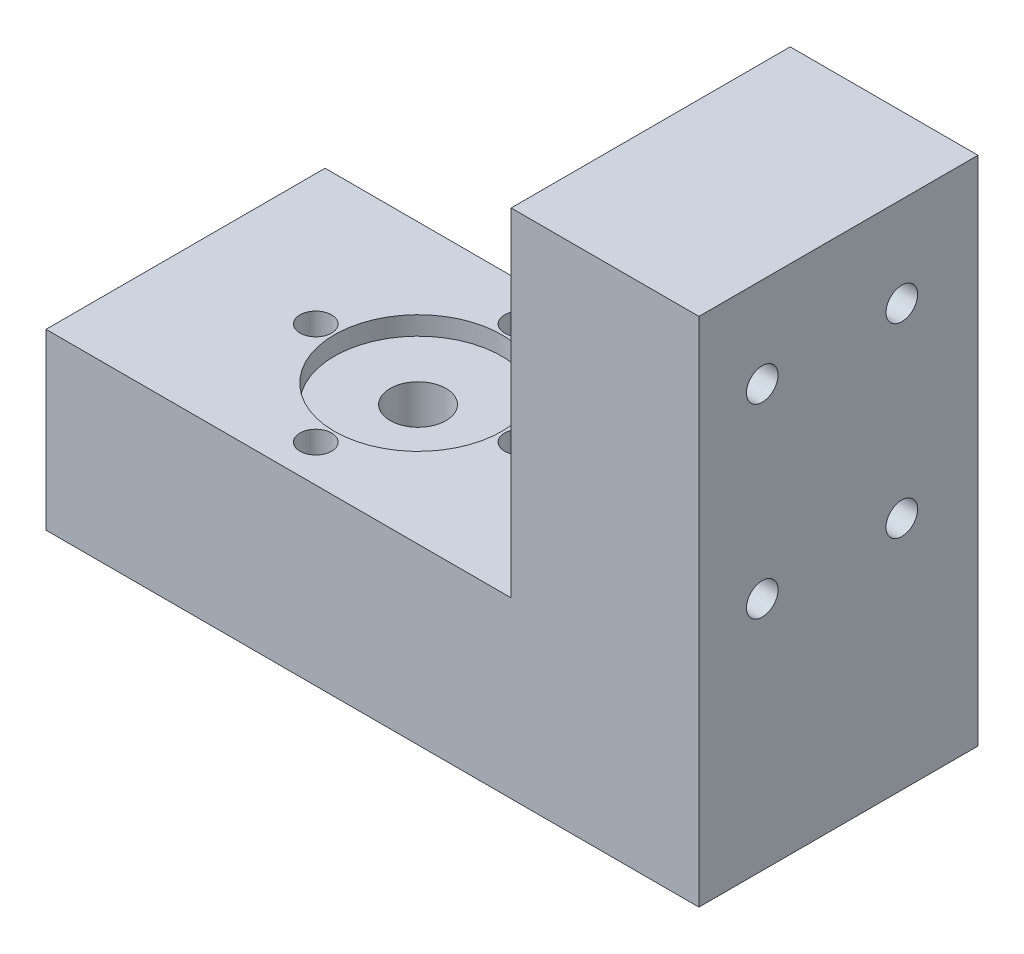
ISO-10303-21;
HEADER;
FILE_DESCRIPTION(('STEP AP214'),'2;1');
FILE_NAME('part.step','',(''),(''),'','','');
FILE_SCHEMA(('AUTOMOTIVE_DESIGN { 1 0 10303 214 1 1 1 1 }'));
ENDSEC;
DATA;
#1=APPLICATION_CONTEXT('core data for automotive mechanical design processes');
#2=APPLICATION_PROTOCOL_DEFINITION('international standard','automotive_design',2000,#1);
#3=PRODUCT_CONTEXT('',#1,'mechanical');
#4=PRODUCT('Part','Part','',(#3));
#5=PRODUCT_RELATED_PRODUCT_CATEGORY('part','',(#4));
#6=PRODUCT_DEFINITION_FORMATION('','',#4);
#7=PRODUCT_DEFINITION_CONTEXT('part definition',#1,'design');
#8=PRODUCT_DEFINITION('design','',#6,#7);
#9=PRODUCT_DEFINITION_SHAPE('','',#8);
#10=(LENGTH_UNIT() NAMED_UNIT(*) SI_UNIT(.MILLI.,.METRE.));
#11=(NAMED_UNIT(*) PLANE_ANGLE_UNIT() SI_UNIT($,.RADIAN.));
#12=(NAMED_UNIT(*) SI_UNIT($,.STERADIAN.) SOLID_ANGLE_UNIT());
#13=UNCERTAINTY_MEASURE_WITH_UNIT(LENGTH_MEASURE(1.E-05),#10,'distance_accuracy_value','');
#14=(GEOMETRIC_REPRESENTATION_CONTEXT(3) GLOBAL_UNCERTAINTY_ASSIGNED_CONTEXT((#13)) GLOBAL_UNIT_ASSIGNED_CONTEXT((#10,
#11,#12)) REPRESENTATION_CONTEXT('',''));
#15=CARTESIAN_POINT('',(0.,0.,0.));
#16=DIRECTION('',(0.,0.,1.));
#17=DIRECTION('',(1.,0.,0.));
#18=AXIS2_PLACEMENT_3D('',#15,#16,#17);
#19=CARTESIAN_POINT('',(70.19,0.,-30.));
#20=DIRECTION('',(0.,-1.,0.));
#21=DIRECTION('',(1.,0.,0.));
#22=AXIS2_PLACEMENT_3D('',#19,#20,#21);
#23=PLANE('',#22);
#24=CARTESIAN_POINT('',(25.,0.,-26.));
#25=DIRECTION('',(0.,1.,0.));
#26=DIRECTION('',(0.,0.,1.));
#27=AXIS2_PLACEMENT_3D('',#24,#25,#26);
#28=CIRCLE('',#27,1.7);
#29=CARTESIAN_POINT('',(25.,0.,-24.3));
#30=VERTEX_POINT('',#29);
#31=EDGE_CURVE('E210',#30,#30,#28,.T.);
#32=ORIENTED_EDGE('',*,*,#31,.T.);
#33=EDGE_LOOP('',(#32));
#34=FACE_BOUND('',#33,.T.);
#35=CARTESIAN_POINT('',(14.0000000000003,0.,-14.9999999999998));
#36=DIRECTION('',(0.,1.,0.));
#37=DIRECTION('',(0.,0.,1.));
#38=AXIS2_PLACEMENT_3D('',#35,#36,#37);
#39=CIRCLE('',#38,1.7);
#40=CARTESIAN_POINT('',(14.0000000000003,0.,-13.2999999999998));
#41=VERTEX_POINT('',#40);
#42=EDGE_CURVE('E209',#41,#41,#39,.T.);
#43=ORIENTED_EDGE('',*,*,#42,.T.);
#44=EDGE_LOOP('',(#43));
#45=FACE_BOUND('',#44,.T.);
#46=CARTESIAN_POINT('',(25.0000000000005,0.,-3.99999999999999));
#47=DIRECTION('',(0.,1.,0.));
#48=DIRECTION('',(0.,0.,1.));
#49=AXIS2_PLACEMENT_3D('',#46,#47,#48);
#50=CIRCLE('',#49,1.7);
#51=CARTESIAN_POINT('',(25.0000000000005,0.,-2.29999999999999));
#52=VERTEX_POINT('',#51);
#53=EDGE_CURVE('E221',#52,#52,#50,.T.);
#54=ORIENTED_EDGE('',*,*,#53,.T.);
#55=EDGE_LOOP('',(#54));
#56=FACE_BOUND('',#55,.T.);
#57=CARTESIAN_POINT('',(36.0000000000003,0.,-15.0000000000002));
#58=DIRECTION('',(0.,1.,0.));
#59=DIRECTION('',(0.,0.,1.));
#60=AXIS2_PLACEMENT_3D('',#57,#58,#59);
#61=CIRCLE('',#60,1.7);
#62=CARTESIAN_POINT('',(36.0000000000003,0.,-13.3000000000002));
#63=VERTEX_POINT('',#62);
#64=EDGE_CURVE('E220',#63,#63,#61,.T.);
#65=ORIENTED_EDGE('',*,*,#64,.T.);
#66=EDGE_LOOP('',(#65));
#67=FACE_BOUND('',#66,.T.);
#68=CARTESIAN_POINT('',(25.,0.,-15.));
#69=DIRECTION('',(0.,1.,0.));
#70=DIRECTION('',(0.,0.,1.));
#71=AXIS2_PLACEMENT_3D('',#68,#69,#70);
#72=CIRCLE('',#71,3.);
#73=CARTESIAN_POINT('',(25.,0.,-12.));
#74=VERTEX_POINT('',#73);
#75=EDGE_CURVE('E216',#74,#74,#72,.T.);
#76=ORIENTED_EDGE('',*,*,#75,.T.);
#77=EDGE_LOOP('',(#76));
#78=FACE_BOUND('',#77,.T.);
#79=DIRECTION('',(1.,0.,0.));
#80=VECTOR('',#79,1.);
#81=CARTESIAN_POINT('',(70.19,0.,0.));
#82=LINE('',#81,#80);
#83=CARTESIAN_POINT('',(0.,0.,0.));
#84=VERTEX_POINT('',#83);
#85=CARTESIAN_POINT('',(70.19,0.,0.));
#86=VERTEX_POINT('',#85);
#87=EDGE_CURVE('E128',#84,#86,#82,.T.);
#88=ORIENTED_EDGE('',*,*,#87,.F.);
#89=DIRECTION('',(0.,0.,1.));
#90=VECTOR('',#89,1.);
#91=CARTESIAN_POINT('',(0.,0.,-30.));
#92=LINE('',#91,#90);
#93=CARTESIAN_POINT('',(0.,0.,-30.));
#94=VERTEX_POINT('',#93);
#95=EDGE_CURVE('E11',#94,#84,#92,.T.);
#96=ORIENTED_EDGE('',*,*,#95,.F.);
#97=DIRECTION('',(1.,0.,0.));
#98=VECTOR('',#97,1.);
#99=CARTESIAN_POINT('',(70.19,0.,-30.));
#100=LINE('',#99,#98);
#101=CARTESIAN_POINT('',(70.19,0.,-30.));
#102=VERTEX_POINT('',#101);
#103=EDGE_CURVE('E143',#94,#102,#100,.T.);
#104=ORIENTED_EDGE('',*,*,#103,.T.);
#105=DIRECTION('',(0.,0.,1.));
#106=VECTOR('',#105,1.);
#107=CARTESIAN_POINT('',(70.19,0.,-30.));
#108=LINE('',#107,#106);
#109=EDGE_CURVE('E92',#102,#86,#108,.T.);
#110=ORIENTED_EDGE('',*,*,#109,.T.);
#111=EDGE_LOOP('',(#88,#96,#104,#110));
#112=FACE_BOUND('',#111,.T.);
#113=ADVANCED_FACE('F42',(#34,#45,#56,#67,#78,#112),#23,.T.);
#114=CARTESIAN_POINT('',(0.,0.,-30.));
#115=DIRECTION('',(-1.,0.,0.));
#116=DIRECTION('',(0.,0.,1.));
#117=AXIS2_PLACEMENT_3D('',#114,#115,#116);
#118=PLANE('',#117);
#119=DIRECTION('',(0.,-1.,0.));
#120=VECTOR('',#119,1.);
#121=CARTESIAN_POINT('',(0.,0.,0.));
#122=LINE('',#121,#120);
#123=CARTESIAN_POINT('',(0.,18.7,0.));
#124=VERTEX_POINT('',#123);
#125=EDGE_CURVE('E141',#124,#84,#122,.T.);
#126=ORIENTED_EDGE('',*,*,#125,.F.);
#127=DIRECTION('',(0.,0.,1.));
#128=VECTOR('',#127,1.);
#129=CARTESIAN_POINT('',(0.,18.7,-30.));
#130=LINE('',#129,#128);
#131=CARTESIAN_POINT('',(0.,18.7,-30.));
#132=VERTEX_POINT('',#131);
#133=EDGE_CURVE('E51',#132,#124,#130,.T.);
#134=ORIENTED_EDGE('',*,*,#133,.F.);
#135=DIRECTION('',(0.,-1.,0.));
#136=VECTOR('',#135,1.);
#137=CARTESIAN_POINT('',(0.,0.,-30.));
#138=LINE('',#137,#136);
#139=EDGE_CURVE('E118',#132,#94,#138,.T.);
#140=ORIENTED_EDGE('',*,*,#139,.T.);
#141=ORIENTED_EDGE('',*,*,#95,.T.);
#142=EDGE_LOOP('',(#126,#134,#140,#141));
#143=FACE_BOUND('',#142,.T.);
#144=ADVANCED_FACE('F152',(#143),#118,.T.);
#145=CARTESIAN_POINT('',(0.,18.7,-30.));
#146=DIRECTION('',(0.,1.,0.));
#147=DIRECTION('',(0.,0.,1.));
#148=AXIS2_PLACEMENT_3D('',#145,#146,#147);
#149=PLANE('',#148);
#150=CARTESIAN_POINT('',(25.,18.7,-26.));
#151=DIRECTION('',(0.,1.,0.));
#152=DIRECTION('',(0.,0.,1.));
#153=AXIS2_PLACEMENT_3D('',#150,#151,#152);
#154=CIRCLE('',#153,1.7);
#155=CARTESIAN_POINT('',(25.,18.7,-24.3));
#156=VERTEX_POINT('',#155);
#157=EDGE_CURVE('E213',#156,#156,#154,.T.);
#158=ORIENTED_EDGE('',*,*,#157,.F.);
#159=EDGE_LOOP('',(#158));
#160=FACE_BOUND('',#159,.T.);
#161=CARTESIAN_POINT('',(14.0000000000003,18.7,-14.9999999999998));
#162=DIRECTION('',(0.,1.,0.));
#163=DIRECTION('',(0.,0.,1.));
#164=AXIS2_PLACEMENT_3D('',#161,#162,#163);
#165=CIRCLE('',#164,1.7);
#166=CARTESIAN_POINT('',(14.0000000000003,18.7,-13.2999999999998));
#167=VERTEX_POINT('',#166);
#168=EDGE_CURVE('E224',#167,#167,#165,.T.);
#169=ORIENTED_EDGE('',*,*,#168,.F.);
#170=EDGE_LOOP('',(#169));
#171=FACE_BOUND('',#170,.T.);
#172=CARTESIAN_POINT('',(25.0000000000005,18.7,-3.99999999999999));
#173=DIRECTION('',(0.,1.,0.));
#174=DIRECTION('',(0.,0.,1.));
#175=AXIS2_PLACEMENT_3D('',#172,#173,#174);
#176=CIRCLE('',#175,1.7);
#177=CARTESIAN_POINT('',(25.0000000000005,18.7,-2.29999999999999));
#178=VERTEX_POINT('',#177);
#179=EDGE_CURVE('E217',#178,#178,#176,.T.);
#180=ORIENTED_EDGE('',*,*,#179,.F.);
#181=EDGE_LOOP('',(#180));
#182=FACE_BOUND('',#181,.T.);
#183=CARTESIAN_POINT('',(36.0000000000003,18.7,-15.0000000000002));
#184=DIRECTION('',(0.,1.,0.));
#185=DIRECTION('',(0.,0.,1.));
#186=AXIS2_PLACEMENT_3D('',#183,#184,#185);
#187=CIRCLE('',#186,1.7);
#188=CARTESIAN_POINT('',(36.0000000000003,18.7,-13.3000000000002));
#189=VERTEX_POINT('',#188);
#190=EDGE_CURVE('E231',#189,#189,#187,.T.);
#191=ORIENTED_EDGE('',*,*,#190,.F.);
#192=EDGE_LOOP('',(#191));
#193=FACE_BOUND('',#192,.T.);
#194=CARTESIAN_POINT('',(25.,18.7,-15.));
#195=DIRECTION('',(0.,1.,0.));
#196=DIRECTION('',(0.,0.,1.));
#197=AXIS2_PLACEMENT_3D('',#194,#195,#196);
#198=CIRCLE('',#197,9.);
#199=CARTESIAN_POINT('',(25.,18.7,-6.));
#200=VERTEX_POINT('',#199);
#201=EDGE_CURVE('E238',#200,#200,#198,.T.);
#202=ORIENTED_EDGE('',*,*,#201,.F.);
#203=EDGE_LOOP('',(#202));
#204=FACE_BOUND('',#203,.T.);
#205=DIRECTION('',(-1.,0.,0.));
#206=VECTOR('',#205,1.);
#207=CARTESIAN_POINT('',(0.,18.7,0.));
#208=LINE('',#207,#206);
#209=CARTESIAN_POINT('',(50.,18.7,0.));
#210=VERTEX_POINT('',#209);
#211=EDGE_CURVE('E105',#210,#124,#208,.T.);
#212=ORIENTED_EDGE('',*,*,#211,.F.);
#213=DIRECTION('',(0.,0.,1.));
#214=VECTOR('',#213,1.);
#215=CARTESIAN_POINT('',(50.,18.7,-30.));
#216=LINE('',#215,#214);
#217=CARTESIAN_POINT('',(50.,18.7,-30.));
#218=VERTEX_POINT('',#217);
#219=EDGE_CURVE('E100',#218,#210,#216,.T.);
#220=ORIENTED_EDGE('',*,*,#219,.F.);
#221=DIRECTION('',(-1.,0.,0.));
#222=VECTOR('',#221,1.);
#223=CARTESIAN_POINT('',(0.,18.7,-30.));
#224=LINE('',#223,#222);
#225=EDGE_CURVE('E103',#218,#132,#224,.T.);
#226=ORIENTED_EDGE('',*,*,#225,.T.);
#227=ORIENTED_EDGE('',*,*,#133,.T.);
#228=EDGE_LOOP('',(#212,#220,#226,#227));
#229=FACE_BOUND('',#228,.T.);
#230=ADVANCED_FACE('F102',(#160,#171,#182,#193,#204,#229),#149,.T.);
#231=CARTESIAN_POINT('',(50.,18.7,-30.));
#232=DIRECTION('',(-1.,0.,0.));
#233=DIRECTION('',(0.,0.,1.));
#234=AXIS2_PLACEMENT_3D('',#231,#232,#233);
#235=PLANE('',#234);
#236=CARTESIAN_POINT('',(50.,25.3039717979105,-6.81050399488545));
#237=DIRECTION('',(-1.,0.,0.));
#238=DIRECTION('',(0.,0.,1.));
#239=AXIS2_PLACEMENT_3D('',#236,#237,#238);
#240=CIRCLE('',#239,1.7);
#241=CARTESIAN_POINT('',(50.,25.3039717979105,-5.11050399488546));
#242=VERTEX_POINT('',#241);
#243=EDGE_CURVE('E206',#242,#242,#240,.T.);
#244=ORIENTED_EDGE('',*,*,#243,.F.);
#245=EDGE_LOOP('',(#244));
#246=FACE_BOUND('',#245,.T.);
#247=CARTESIAN_POINT('',(50.,45.3039717979105,-21.8105039948855));
#248=DIRECTION('',(-1.,0.,0.));
#249=DIRECTION('',(0.,0.,1.));
#250=AXIS2_PLACEMENT_3D('',#247,#248,#249);
#251=CIRCLE('',#250,1.7);
#252=CARTESIAN_POINT('',(50.,45.3039717979105,-20.1105039948855));
#253=VERTEX_POINT('',#252);
#254=EDGE_CURVE('E203',#253,#253,#251,.T.);
#255=ORIENTED_EDGE('',*,*,#254,.F.);
#256=EDGE_LOOP('',(#255));
#257=FACE_BOUND('',#256,.T.);
#258=CARTESIAN_POINT('',(50.,25.3039717979105,-21.8105039948855));
#259=DIRECTION('',(-1.,0.,0.));
#260=DIRECTION('',(0.,0.,1.));
#261=AXIS2_PLACEMENT_3D('',#258,#259,#260);
#262=CIRCLE('',#261,1.7);
#263=CARTESIAN_POINT('',(50.,25.3039717979105,-20.1105039948855));
#264=VERTEX_POINT('',#263);
#265=EDGE_CURVE('E196',#264,#264,#262,.T.);
#266=ORIENTED_EDGE('',*,*,#265,.F.);
#267=EDGE_LOOP('',(#266));
#268=FACE_BOUND('',#267,.T.);
#269=CARTESIAN_POINT('',(50.,45.3039717979105,-6.81050399488545));
#270=DIRECTION('',(-1.,0.,0.));
#271=DIRECTION('',(0.,0.,1.));
#272=AXIS2_PLACEMENT_3D('',#269,#270,#271);
#273=CIRCLE('',#272,1.7);
#274=CARTESIAN_POINT('',(50.,45.3039717979105,-5.11050399488546));
#275=VERTEX_POINT('',#274);
#276=EDGE_CURVE('E193',#275,#275,#273,.T.);
#277=ORIENTED_EDGE('',*,*,#276,.F.);
#278=EDGE_LOOP('',(#277));
#279=FACE_BOUND('',#278,.T.);
#280=DIRECTION('',(0.,-1.,0.));
#281=VECTOR('',#280,1.);
#282=CARTESIAN_POINT('',(50.,18.7,0.));
#283=LINE('',#282,#281);
#284=CARTESIAN_POINT('',(50.,55.,0.));
#285=VERTEX_POINT('',#284);
#286=EDGE_CURVE('E138',#285,#210,#283,.T.);
#287=ORIENTED_EDGE('',*,*,#286,.F.);
#288=DIRECTION('',(0.,0.,1.));
#289=VECTOR('',#288,1.);
#290=CARTESIAN_POINT('',(50.,55.,-30.));
#291=LINE('',#290,#289);
#292=CARTESIAN_POINT('',(50.,55.,-30.));
#293=VERTEX_POINT('',#292);
#294=EDGE_CURVE('E110',#293,#285,#291,.T.);
#295=ORIENTED_EDGE('',*,*,#294,.F.);
#296=DIRECTION('',(0.,-1.,0.));
#297=VECTOR('',#296,1.);
#298=CARTESIAN_POINT('',(50.,18.7,-30.));
#299=LINE('',#298,#297);
#300=EDGE_CURVE('E116',#293,#218,#299,.T.);
#301=ORIENTED_EDGE('',*,*,#300,.T.);
#302=ORIENTED_EDGE('',*,*,#219,.T.);
#303=EDGE_LOOP('',(#287,#295,#301,#302));
#304=FACE_BOUND('',#303,.T.);
#305=ADVANCED_FACE('F120',(#246,#257,#268,#279,#304),#235,.T.);
#306=CARTESIAN_POINT('',(50.,55.,-30.));
#307=DIRECTION('',(0.,1.,0.));
#308=DIRECTION('',(0.,0.,1.));
#309=AXIS2_PLACEMENT_3D('',#306,#307,#308);
#310=PLANE('',#309);
#311=DIRECTION('',(-1.,0.,0.));
#312=VECTOR('',#311,1.);
#313=CARTESIAN_POINT('',(50.,55.,0.));
#314=LINE('',#313,#312);
#315=CARTESIAN_POINT('',(70.19,55.,0.));
#316=VERTEX_POINT('',#315);
#317=EDGE_CURVE('E135',#316,#285,#314,.T.);
#318=ORIENTED_EDGE('',*,*,#317,.F.);
#319=DIRECTION('',(0.,0.,1.));
#320=VECTOR('',#319,1.);
#321=CARTESIAN_POINT('',(70.19,55.,-30.));
#322=LINE('',#321,#320);
#323=CARTESIAN_POINT('',(70.19,55.,-30.));
#324=VERTEX_POINT('',#323);
#325=EDGE_CURVE('E147',#324,#316,#322,.T.);
#326=ORIENTED_EDGE('',*,*,#325,.F.);
#327=DIRECTION('',(-1.,0.,0.));
#328=VECTOR('',#327,1.);
#329=CARTESIAN_POINT('',(50.,55.,-30.));
#330=LINE('',#329,#328);
#331=EDGE_CURVE('E121',#324,#293,#330,.T.);
#332=ORIENTED_EDGE('',*,*,#331,.T.);
#333=ORIENTED_EDGE('',*,*,#294,.T.);
#334=EDGE_LOOP('',(#318,#326,#332,#333));
#335=FACE_BOUND('',#334,.T.);
#336=ADVANCED_FACE('F168',(#335),#310,.T.);
#337=CARTESIAN_POINT('',(70.19,55.,-30.));
#338=DIRECTION('',(1.,0.,0.));
#339=DIRECTION('',(0.,1.,0.));
#340=AXIS2_PLACEMENT_3D('',#337,#338,#339);
#341=PLANE('',#340);
#342=CARTESIAN_POINT('',(70.19,25.3039717979105,-6.81050399488545));
#343=DIRECTION('',(1.,0.,0.));
#344=DIRECTION('',(0.,1.,0.));
#345=AXIS2_PLACEMENT_3D('',#342,#343,#344);
#346=CIRCLE('',#345,1.7);
#347=CARTESIAN_POINT('',(70.19,27.0039717979105,-6.81050399488545));
#348=VERTEX_POINT('',#347);
#349=EDGE_CURVE('E180',#348,#348,#346,.T.);
#350=ORIENTED_EDGE('',*,*,#349,.F.);
#351=EDGE_LOOP('',(#350));
#352=FACE_BOUND('',#351,.T.);
#353=CARTESIAN_POINT('',(70.19,45.3039717979105,-21.8105039948855));
#354=DIRECTION('',(1.,0.,0.));
#355=DIRECTION('',(0.,1.,0.));
#356=AXIS2_PLACEMENT_3D('',#353,#354,#355);
#357=CIRCLE('',#356,1.7);
#358=CARTESIAN_POINT('',(70.19,47.0039717979105,-21.8105039948855));
#359=VERTEX_POINT('',#358);
#360=EDGE_CURVE('E184',#359,#359,#357,.T.);
#361=ORIENTED_EDGE('',*,*,#360,.F.);
#362=EDGE_LOOP('',(#361));
#363=FACE_BOUND('',#362,.T.);
#364=CARTESIAN_POINT('',(70.19,25.3039717979105,-21.8105039948855));
#365=DIRECTION('',(1.,0.,0.));
#366=DIRECTION('',(0.,1.,0.));
#367=AXIS2_PLACEMENT_3D('',#364,#365,#366);
#368=CIRCLE('',#367,1.7);
#369=CARTESIAN_POINT('',(70.19,27.0039717979105,-21.8105039948855));
#370=VERTEX_POINT('',#369);
#371=EDGE_CURVE('E188',#370,#370,#368,.T.);
#372=ORIENTED_EDGE('',*,*,#371,.F.);
#373=EDGE_LOOP('',(#372));
#374=FACE_BOUND('',#373,.T.);
#375=CARTESIAN_POINT('',(70.19,45.3039717979105,-6.81050399488545));
#376=DIRECTION('',(1.,0.,0.));
#377=DIRECTION('',(0.,1.,0.));
#378=AXIS2_PLACEMENT_3D('',#375,#376,#377);
#379=CIRCLE('',#378,1.7);
#380=CARTESIAN_POINT('',(70.19,47.0039717979105,-6.81050399488545));
#381=VERTEX_POINT('',#380);
#382=EDGE_CURVE('E191',#381,#381,#379,.T.);
#383=ORIENTED_EDGE('',*,*,#382,.F.);
#384=EDGE_LOOP('',(#383));
#385=FACE_BOUND('',#384,.T.);
#386=DIRECTION('',(0.,1.,0.));
#387=VECTOR('',#386,1.);
#388=CARTESIAN_POINT('',(70.19,55.,0.));
#389=LINE('',#388,#387);
#390=EDGE_CURVE('E131',#86,#316,#389,.T.);
#391=ORIENTED_EDGE('',*,*,#390,.F.);
#392=ORIENTED_EDGE('',*,*,#109,.F.);
#393=DIRECTION('',(0.,1.,0.));
#394=VECTOR('',#393,1.);
#395=CARTESIAN_POINT('',(70.19,55.,-30.));
#396=LINE('',#395,#394);
#397=EDGE_CURVE('E123',#102,#324,#396,.T.);
#398=ORIENTED_EDGE('',*,*,#397,.T.);
#399=ORIENTED_EDGE('',*,*,#325,.T.);
#400=EDGE_LOOP('',(#391,#392,#398,#399));
#401=FACE_BOUND('',#400,.T.);
#402=ADVANCED_FACE('F148',(#352,#363,#374,#385,#401),#341,.T.);
#403=CARTESIAN_POINT('',(0.,0.,-30.));
#404=DIRECTION('',(0.,0.,-1.));
#405=DIRECTION('',(-1.,0.,0.));
#406=AXIS2_PLACEMENT_3D('',#403,#404,#405);
#407=PLANE('',#406);
#408=ORIENTED_EDGE('',*,*,#103,.F.);
#409=ORIENTED_EDGE('',*,*,#139,.F.);
#410=ORIENTED_EDGE('',*,*,#225,.F.);
#411=ORIENTED_EDGE('',*,*,#300,.F.);
#412=ORIENTED_EDGE('',*,*,#331,.F.);
#413=ORIENTED_EDGE('',*,*,#397,.F.);
#414=EDGE_LOOP('',(#408,#409,#410,#411,#412,#413));
#415=FACE_BOUND('',#414,.T.);
#416=ADVANCED_FACE('F114',(#415),#407,.T.);
#417=CARTESIAN_POINT('',(0.,0.,0.));
#418=DIRECTION('',(0.,0.,-1.));
#419=DIRECTION('',(-1.,0.,0.));
#420=AXIS2_PLACEMENT_3D('',#417,#418,#419);
#421=PLANE('',#420);
#422=ORIENTED_EDGE('',*,*,#87,.T.);
#423=ORIENTED_EDGE('',*,*,#390,.T.);
#424=ORIENTED_EDGE('',*,*,#317,.T.);
#425=ORIENTED_EDGE('',*,*,#286,.T.);
#426=ORIENTED_EDGE('',*,*,#211,.T.);
#427=ORIENTED_EDGE('',*,*,#125,.T.);
#428=EDGE_LOOP('',(#422,#423,#424,#425,#426,#427));
#429=FACE_BOUND('',#428,.T.);
#430=ADVANCED_FACE('F151',(#429),#421,.F.);
#431=CARTESIAN_POINT('',(25.,16.7,-15.));
#432=DIRECTION('',(0.,1.,0.));
#433=DIRECTION('',(0.,0.,1.));
#434=AXIS2_PLACEMENT_3D('',#431,#432,#433);
#435=CYLINDRICAL_SURFACE('',#434,9.);
#436=CARTESIAN_POINT('',(25.,16.7,-15.));
#437=DIRECTION('',(0.,1.,0.));
#438=DIRECTION('',(0.,0.,1.));
#439=AXIS2_PLACEMENT_3D('',#436,#437,#438);
#440=CIRCLE('',#439,9.);
#441=CARTESIAN_POINT('',(25.,16.7,-6.));
#442=VERTEX_POINT('',#441);
#443=EDGE_CURVE('E132',#442,#442,#440,.T.);
#444=ORIENTED_EDGE('',*,*,#443,.F.);
#445=EDGE_LOOP('',(#444));
#446=FACE_BOUND('',#445,.T.);
#447=ORIENTED_EDGE('',*,*,#201,.T.);
#448=EDGE_LOOP('',(#447));
#449=FACE_BOUND('',#448,.T.);
#450=ADVANCED_FACE('F252',(#446,#449),#435,.F.);
#451=CARTESIAN_POINT('',(25.,16.7,-15.));
#452=DIRECTION('',(0.,1.,0.));
#453=DIRECTION('',(0.,0.,1.));
#454=AXIS2_PLACEMENT_3D('',#451,#452,#453);
#455=PLANE('',#454);
#456=CARTESIAN_POINT('',(25.,16.7,-15.));
#457=DIRECTION('',(0.,1.,0.));
#458=DIRECTION('',(0.,0.,1.));
#459=AXIS2_PLACEMENT_3D('',#456,#457,#458);
#460=CIRCLE('',#459,3.);
#461=CARTESIAN_POINT('',(25.,16.7,-12.));
#462=VERTEX_POINT('',#461);
#463=EDGE_CURVE('E45',#462,#462,#460,.T.);
#464=ORIENTED_EDGE('',*,*,#463,.F.);
#465=EDGE_LOOP('',(#464));
#466=FACE_BOUND('',#465,.T.);
#467=ORIENTED_EDGE('',*,*,#443,.T.);
#468=EDGE_LOOP('',(#467));
#469=FACE_BOUND('',#468,.T.);
#470=ADVANCED_FACE('F249',(#466,#469),#455,.T.);
#471=CARTESIAN_POINT('',(25.,0.,-15.));
#472=DIRECTION('',(0.,1.,0.));
#473=DIRECTION('',(0.,0.,1.));
#474=AXIS2_PLACEMENT_3D('',#471,#472,#473);
#475=CYLINDRICAL_SURFACE('',#474,3.);
#476=ORIENTED_EDGE('',*,*,#463,.T.);
#477=EDGE_LOOP('',(#476));
#478=FACE_BOUND('',#477,.T.);
#479=ORIENTED_EDGE('',*,*,#75,.F.);
#480=EDGE_LOOP('',(#479));
#481=FACE_BOUND('',#480,.T.);
#482=ADVANCED_FACE('F246',(#478,#481),#475,.F.);
#483=CARTESIAN_POINT('',(36.0000000000003,0.,-15.0000000000002));
#484=DIRECTION('',(0.,1.,0.));
#485=DIRECTION('',(0.,0.,1.));
#486=AXIS2_PLACEMENT_3D('',#483,#484,#485);
#487=CYLINDRICAL_SURFACE('',#486,1.7);
#488=ORIENTED_EDGE('',*,*,#64,.F.);
#489=EDGE_LOOP('',(#488));
#490=FACE_BOUND('',#489,.T.);
#491=ORIENTED_EDGE('',*,*,#190,.T.);
#492=EDGE_LOOP('',(#491));
#493=FACE_BOUND('',#492,.T.);
#494=ADVANCED_FACE('F262',(#490,#493),#487,.F.);
#495=CARTESIAN_POINT('',(25.0000000000005,0.,-3.99999999999999));
#496=DIRECTION('',(0.,1.,0.));
#497=DIRECTION('',(0.,0.,1.));
#498=AXIS2_PLACEMENT_3D('',#495,#496,#497);
#499=CYLINDRICAL_SURFACE('',#498,1.7);
#500=ORIENTED_EDGE('',*,*,#53,.F.);
#501=EDGE_LOOP('',(#500));
#502=FACE_BOUND('',#501,.T.);
#503=ORIENTED_EDGE('',*,*,#179,.T.);
#504=EDGE_LOOP('',(#503));
#505=FACE_BOUND('',#504,.T.);
#506=ADVANCED_FACE('F265',(#502,#505),#499,.F.);
#507=CARTESIAN_POINT('',(14.0000000000003,0.,-14.9999999999998));
#508=DIRECTION('',(0.,1.,0.));
#509=DIRECTION('',(0.,0.,1.));
#510=AXIS2_PLACEMENT_3D('',#507,#508,#509);
#511=CYLINDRICAL_SURFACE('',#510,1.7);
#512=ORIENTED_EDGE('',*,*,#42,.F.);
#513=EDGE_LOOP('',(#512));
#514=FACE_BOUND('',#513,.T.);
#515=ORIENTED_EDGE('',*,*,#168,.T.);
#516=EDGE_LOOP('',(#515));
#517=FACE_BOUND('',#516,.T.);
#518=ADVANCED_FACE('F269',(#514,#517),#511,.F.);
#519=CARTESIAN_POINT('',(25.,0.,-26.));
#520=DIRECTION('',(0.,1.,0.));
#521=DIRECTION('',(0.,0.,1.));
#522=AXIS2_PLACEMENT_3D('',#519,#520,#521);
#523=CYLINDRICAL_SURFACE('',#522,1.7);
#524=ORIENTED_EDGE('',*,*,#31,.F.);
#525=EDGE_LOOP('',(#524));
#526=FACE_BOUND('',#525,.T.);
#527=ORIENTED_EDGE('',*,*,#157,.T.);
#528=EDGE_LOOP('',(#527));
#529=FACE_BOUND('',#528,.T.);
#530=ADVANCED_FACE('F272',(#526,#529),#523,.F.);
#531=CARTESIAN_POINT('',(0.,45.3039717979105,-6.81050399488545));
#532=DIRECTION('',(1.,0.,0.));
#533=DIRECTION('',(0.,1.,0.));
#534=AXIS2_PLACEMENT_3D('',#531,#532,#533);
#535=CYLINDRICAL_SURFACE('',#534,1.7);
#536=ORIENTED_EDGE('',*,*,#276,.T.);
#537=EDGE_LOOP('',(#536));
#538=FACE_BOUND('',#537,.T.);
#539=ORIENTED_EDGE('',*,*,#382,.T.);
#540=EDGE_LOOP('',(#539));
#541=FACE_BOUND('',#540,.T.);
#542=ADVANCED_FACE('F279',(#538,#541),#535,.F.);
#543=CARTESIAN_POINT('',(0.,25.3039717979105,-21.8105039948855));
#544=DIRECTION('',(1.,0.,0.));
#545=DIRECTION('',(0.,1.,0.));
#546=AXIS2_PLACEMENT_3D('',#543,#544,#545);
#547=CYLINDRICAL_SURFACE('',#546,1.7);
#548=ORIENTED_EDGE('',*,*,#265,.T.);
#549=EDGE_LOOP('',(#548));
#550=FACE_BOUND('',#549,.T.);
#551=ORIENTED_EDGE('',*,*,#371,.T.);
#552=EDGE_LOOP('',(#551));
#553=FACE_BOUND('',#552,.T.);
#554=ADVANCED_FACE('F282',(#550,#553),#547,.F.);
#555=CARTESIAN_POINT('',(0.,45.3039717979105,-21.8105039948855));
#556=DIRECTION('',(1.,0.,0.));
#557=DIRECTION('',(0.,1.,0.));
#558=AXIS2_PLACEMENT_3D('',#555,#556,#557);
#559=CYLINDRICAL_SURFACE('',#558,1.7);
#560=ORIENTED_EDGE('',*,*,#254,.T.);
#561=EDGE_LOOP('',(#560));
#562=FACE_BOUND('',#561,.T.);
#563=ORIENTED_EDGE('',*,*,#360,.T.);
#564=EDGE_LOOP('',(#563));
#565=FACE_BOUND('',#564,.T.);
#566=ADVANCED_FACE('F284',(#562,#565),#559,.F.);
#567=CARTESIAN_POINT('',(0.,25.3039717979105,-6.81050399488545));
#568=DIRECTION('',(1.,0.,0.));
#569=DIRECTION('',(0.,1.,0.));
#570=AXIS2_PLACEMENT_3D('',#567,#568,#569);
#571=CYLINDRICAL_SURFACE('',#570,1.7);
#572=ORIENTED_EDGE('',*,*,#243,.T.);
#573=EDGE_LOOP('',(#572));
#574=FACE_BOUND('',#573,.T.);
#575=ORIENTED_EDGE('',*,*,#349,.T.);
#576=EDGE_LOOP('',(#575));
#577=FACE_BOUND('',#576,.T.);
#578=ADVANCED_FACE('F287',(#574,#577),#571,.F.);
#579=CLOSED_SHELL('',(#113,#144,#230,#305,#336,#402,#416,#430,#450,#470,#482,#494,#506,#518,
#530,#542,#554,#566,#578));
#580=MANIFOLD_SOLID_BREP('B2',#579);
#581=ADVANCED_BREP_SHAPE_REPRESENTATION('',(#18,#580),#14);
#582=SHAPE_DEFINITION_REPRESENTATION(#9,#581);
ENDSEC;
END-ISO-10303-21;
